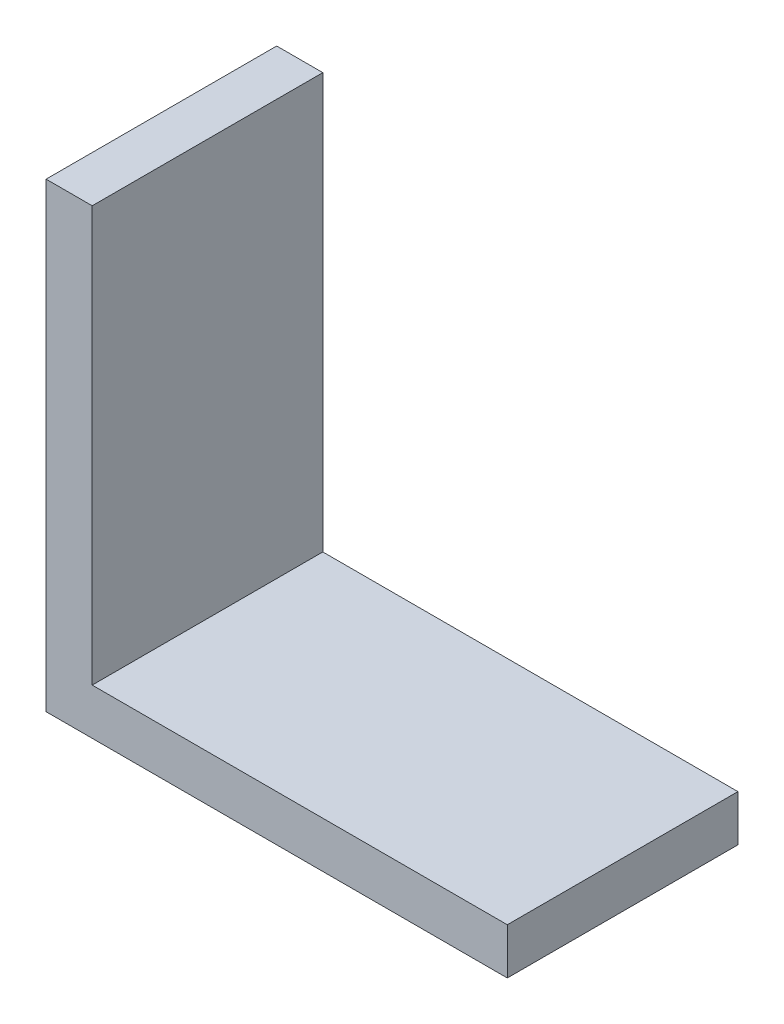
ISO-10303-21;
HEADER;
FILE_DESCRIPTION(('STEP AP214'),'2;1');
FILE_NAME('part.step','',(''),(''),'','','');
FILE_SCHEMA(('AUTOMOTIVE_DESIGN { 1 0 10303 214 1 1 1 1 }'));
ENDSEC;
DATA;
#1=APPLICATION_CONTEXT('core data for automotive mechanical design processes');
#2=APPLICATION_PROTOCOL_DEFINITION('international standard','automotive_design',2000,#1);
#3=PRODUCT_CONTEXT('',#1,'mechanical');
#4=PRODUCT('Part','Part','',(#3));
#5=PRODUCT_RELATED_PRODUCT_CATEGORY('part','',(#4));
#6=PRODUCT_DEFINITION_FORMATION('','',#4);
#7=PRODUCT_DEFINITION_CONTEXT('part definition',#1,'design');
#8=PRODUCT_DEFINITION('design','',#6,#7);
#9=PRODUCT_DEFINITION_SHAPE('','',#8);
#10=(LENGTH_UNIT() NAMED_UNIT(*) SI_UNIT(.MILLI.,.METRE.));
#11=(NAMED_UNIT(*) PLANE_ANGLE_UNIT() SI_UNIT($,.RADIAN.));
#12=(NAMED_UNIT(*) SI_UNIT($,.STERADIAN.) SOLID_ANGLE_UNIT());
#13=UNCERTAINTY_MEASURE_WITH_UNIT(LENGTH_MEASURE(1.E-05),#10,'distance_accuracy_value','');
#14=(GEOMETRIC_REPRESENTATION_CONTEXT(3) GLOBAL_UNCERTAINTY_ASSIGNED_CONTEXT((#13)) GLOBAL_UNIT_ASSIGNED_CONTEXT((#10,
#11,#12)) REPRESENTATION_CONTEXT('',''));
#15=CARTESIAN_POINT('',(0.,0.,0.));
#16=DIRECTION('',(0.,0.,1.));
#17=DIRECTION('',(1.,0.,0.));
#18=AXIS2_PLACEMENT_3D('',#15,#16,#17);
#19=CARTESIAN_POINT('',(0.,0.,10.));
#20=DIRECTION('',(0.,1.,0.));
#21=DIRECTION('',(0.,0.,1.));
#22=AXIS2_PLACEMENT_3D('',#19,#20,#21);
#23=PLANE('',#22);
#24=DIRECTION('',(1.,0.,0.));
#25=VECTOR('',#24,1.);
#26=CARTESIAN_POINT('',(0.,0.,-10.));
#27=LINE('',#26,#25);
#28=CARTESIAN_POINT('',(0.,0.,-10.));
#29=VERTEX_POINT('',#28);
#30=CARTESIAN_POINT('',(40.,0.,-10.));
#31=VERTEX_POINT('',#30);
#32=EDGE_CURVE('E115',#29,#31,#27,.T.);
#33=ORIENTED_EDGE('',*,*,#32,.T.);
#34=DIRECTION('',(0.,0.,-1.));
#35=VECTOR('',#34,1.);
#36=CARTESIAN_POINT('',(40.,0.,10.));
#37=LINE('',#36,#35);
#38=CARTESIAN_POINT('',(40.,0.,10.));
#39=VERTEX_POINT('',#38);
#40=EDGE_CURVE('E11',#39,#31,#37,.T.);
#41=ORIENTED_EDGE('',*,*,#40,.F.);
#42=DIRECTION('',(1.,0.,0.));
#43=VECTOR('',#42,1.);
#44=CARTESIAN_POINT('',(0.,0.,10.));
#45=LINE('',#44,#43);
#46=CARTESIAN_POINT('',(0.,0.,10.));
#47=VERTEX_POINT('',#46);
#48=EDGE_CURVE('E80',#47,#39,#45,.T.);
#49=ORIENTED_EDGE('',*,*,#48,.F.);
#50=DIRECTION('',(0.,0.,-1.));
#51=VECTOR('',#50,1.);
#52=CARTESIAN_POINT('',(0.,0.,10.));
#53=LINE('',#52,#51);
#54=EDGE_CURVE('E111',#47,#29,#53,.T.);
#55=ORIENTED_EDGE('',*,*,#54,.T.);
#56=EDGE_LOOP('',(#33,#41,#49,#55));
#57=FACE_BOUND('',#56,.T.);
#58=ADVANCED_FACE('F34',(#57),#23,.F.);
#59=CARTESIAN_POINT('',(40.,4.,10.));
#60=DIRECTION('',(1.,0.,0.));
#61=DIRECTION('',(0.,0.,-1.));
#62=AXIS2_PLACEMENT_3D('',#59,#60,#61);
#63=PLANE('',#62);
#64=DIRECTION('',(0.,-1.,0.));
#65=VECTOR('',#64,1.);
#66=CARTESIAN_POINT('',(40.,4.,-10.));
#67=LINE('',#66,#65);
#68=CARTESIAN_POINT('',(40.,4.,-10.));
#69=VERTEX_POINT('',#68);
#70=EDGE_CURVE('E118',#69,#31,#67,.T.);
#71=ORIENTED_EDGE('',*,*,#70,.F.);
#72=DIRECTION('',(0.,0.,-1.));
#73=VECTOR('',#72,1.);
#74=CARTESIAN_POINT('',(40.,4.,10.));
#75=LINE('',#74,#73);
#76=CARTESIAN_POINT('',(40.,4.,10.));
#77=VERTEX_POINT('',#76);
#78=EDGE_CURVE('E42',#77,#69,#75,.T.);
#79=ORIENTED_EDGE('',*,*,#78,.F.);
#80=DIRECTION('',(0.,-1.,0.));
#81=VECTOR('',#80,1.);
#82=CARTESIAN_POINT('',(40.,4.,10.));
#83=LINE('',#82,#81);
#84=EDGE_CURVE('E204',#77,#39,#83,.T.);
#85=ORIENTED_EDGE('',*,*,#84,.T.);
#86=ORIENTED_EDGE('',*,*,#40,.T.);
#87=EDGE_LOOP('',(#71,#79,#85,#86));
#88=FACE_BOUND('',#87,.T.);
#89=ADVANCED_FACE('F136',(#88),#63,.T.);
#90=CARTESIAN_POINT('',(0.,4.,10.));
#91=DIRECTION('',(0.,1.,0.));
#92=DIRECTION('',(0.,0.,1.));
#93=AXIS2_PLACEMENT_3D('',#90,#91,#92);
#94=PLANE('',#93);
#95=DIRECTION('',(1.,0.,0.));
#96=VECTOR('',#95,1.);
#97=CARTESIAN_POINT('',(0.,4.,-10.));
#98=LINE('',#97,#96);
#99=CARTESIAN_POINT('',(4.,4.,-10.));
#100=VERTEX_POINT('',#99);
#101=EDGE_CURVE('E121',#100,#69,#98,.T.);
#102=ORIENTED_EDGE('',*,*,#101,.F.);
#103=DIRECTION('',(0.,0.,-1.));
#104=VECTOR('',#103,1.);
#105=CARTESIAN_POINT('',(4.,4.,10.));
#106=LINE('',#105,#104);
#107=CARTESIAN_POINT('',(4.,4.,10.));
#108=VERTEX_POINT('',#107);
#109=EDGE_CURVE('E101',#108,#100,#106,.T.);
#110=ORIENTED_EDGE('',*,*,#109,.F.);
#111=DIRECTION('',(1.,0.,0.));
#112=VECTOR('',#111,1.);
#113=CARTESIAN_POINT('',(0.,4.,10.));
#114=LINE('',#113,#112);
#115=EDGE_CURVE('E107',#108,#77,#114,.T.);
#116=ORIENTED_EDGE('',*,*,#115,.T.);
#117=ORIENTED_EDGE('',*,*,#78,.T.);
#118=EDGE_LOOP('',(#102,#110,#116,#117));
#119=FACE_BOUND('',#118,.T.);
#120=ADVANCED_FACE('F133',(#119),#94,.T.);
#121=CARTESIAN_POINT('',(4.,40.,10.));
#122=DIRECTION('',(1.,0.,0.));
#123=DIRECTION('',(0.,1.,0.));
#124=AXIS2_PLACEMENT_3D('',#121,#122,#123);
#125=PLANE('',#124);
#126=DIRECTION('',(0.,-1.,0.));
#127=VECTOR('',#126,1.);
#128=CARTESIAN_POINT('',(4.,40.,-10.));
#129=LINE('',#128,#127);
#130=CARTESIAN_POINT('',(4.,40.,-10.));
#131=VERTEX_POINT('',#130);
#132=EDGE_CURVE('E96',#131,#100,#129,.T.);
#133=ORIENTED_EDGE('',*,*,#132,.F.);
#134=DIRECTION('',(0.,0.,-1.));
#135=VECTOR('',#134,1.);
#136=CARTESIAN_POINT('',(4.,40.,10.));
#137=LINE('',#136,#135);
#138=CARTESIAN_POINT('',(4.,40.,10.));
#139=VERTEX_POINT('',#138);
#140=EDGE_CURVE('E91',#139,#131,#137,.T.);
#141=ORIENTED_EDGE('',*,*,#140,.F.);
#142=DIRECTION('',(0.,-1.,0.));
#143=VECTOR('',#142,1.);
#144=CARTESIAN_POINT('',(4.,40.,10.));
#145=LINE('',#144,#143);
#146=EDGE_CURVE('E94',#139,#108,#145,.T.);
#147=ORIENTED_EDGE('',*,*,#146,.T.);
#148=ORIENTED_EDGE('',*,*,#109,.T.);
#149=EDGE_LOOP('',(#133,#141,#147,#148));
#150=FACE_BOUND('',#149,.T.);
#151=ADVANCED_FACE('F93',(#150),#125,.T.);
#152=CARTESIAN_POINT('',(0.,40.,10.));
#153=DIRECTION('',(0.,1.,0.));
#154=DIRECTION('',(0.,0.,1.));
#155=AXIS2_PLACEMENT_3D('',#152,#153,#154);
#156=PLANE('',#155);
#157=DIRECTION('',(1.,0.,0.));
#158=VECTOR('',#157,1.);
#159=CARTESIAN_POINT('',(0.,40.,-10.));
#160=LINE('',#159,#158);
#161=CARTESIAN_POINT('',(0.,40.,-10.));
#162=VERTEX_POINT('',#161);
#163=EDGE_CURVE('E125',#162,#131,#160,.T.);
#164=ORIENTED_EDGE('',*,*,#163,.F.);
#165=DIRECTION('',(0.,0.,-1.));
#166=VECTOR('',#165,1.);
#167=CARTESIAN_POINT('',(0.,40.,10.));
#168=LINE('',#167,#166);
#169=CARTESIAN_POINT('',(0.,40.,10.));
#170=VERTEX_POINT('',#169);
#171=EDGE_CURVE('E71',#170,#162,#168,.T.);
#172=ORIENTED_EDGE('',*,*,#171,.F.);
#173=DIRECTION('',(1.,0.,0.));
#174=VECTOR('',#173,1.);
#175=CARTESIAN_POINT('',(0.,40.,10.));
#176=LINE('',#175,#174);
#177=EDGE_CURVE('E105',#170,#139,#176,.T.);
#178=ORIENTED_EDGE('',*,*,#177,.T.);
#179=ORIENTED_EDGE('',*,*,#140,.T.);
#180=EDGE_LOOP('',(#164,#172,#178,#179));
#181=FACE_BOUND('',#180,.T.);
#182=ADVANCED_FACE('F109',(#181),#156,.T.);
#183=CARTESIAN_POINT('',(0.,40.,10.));
#184=DIRECTION('',(1.,0.,0.));
#185=DIRECTION('',(0.,1.,0.));
#186=AXIS2_PLACEMENT_3D('',#183,#184,#185);
#187=PLANE('',#186);
#188=DIRECTION('',(0.,-1.,0.));
#189=VECTOR('',#188,1.);
#190=CARTESIAN_POINT('',(0.,40.,-10.));
#191=LINE('',#190,#189);
#192=EDGE_CURVE('E74',#162,#29,#191,.T.);
#193=ORIENTED_EDGE('',*,*,#192,.T.);
#194=ORIENTED_EDGE('',*,*,#54,.F.);
#195=DIRECTION('',(0.,-1.,0.));
#196=VECTOR('',#195,1.);
#197=CARTESIAN_POINT('',(0.,40.,10.));
#198=LINE('',#197,#196);
#199=EDGE_CURVE('E50',#170,#47,#198,.T.);
#200=ORIENTED_EDGE('',*,*,#199,.F.);
#201=ORIENTED_EDGE('',*,*,#171,.T.);
#202=EDGE_LOOP('',(#193,#194,#200,#201));
#203=FACE_BOUND('',#202,.T.);
#204=ADVANCED_FACE('F141',(#203),#187,.F.);
#205=CARTESIAN_POINT('',(40.,0.,10.));
#206=DIRECTION('',(0.,0.,-1.));
#207=DIRECTION('',(-1.,0.,0.));
#208=AXIS2_PLACEMENT_3D('',#205,#206,#207);
#209=PLANE('',#208);
#210=ORIENTED_EDGE('',*,*,#48,.T.);
#211=ORIENTED_EDGE('',*,*,#84,.F.);
#212=ORIENTED_EDGE('',*,*,#115,.F.);
#213=ORIENTED_EDGE('',*,*,#146,.F.);
#214=ORIENTED_EDGE('',*,*,#177,.F.);
#215=ORIENTED_EDGE('',*,*,#199,.T.);
#216=EDGE_LOOP('',(#210,#211,#212,#213,#214,#215));
#217=FACE_BOUND('',#216,.T.);
#218=ADVANCED_FACE('F104',(#217),#209,.F.);
#219=CARTESIAN_POINT('',(40.,0.,-10.));
#220=DIRECTION('',(0.,0.,-1.));
#221=DIRECTION('',(-1.,0.,0.));
#222=AXIS2_PLACEMENT_3D('',#219,#220,#221);
#223=PLANE('',#222);
#224=ORIENTED_EDGE('',*,*,#32,.F.);
#225=ORIENTED_EDGE('',*,*,#192,.F.);
#226=ORIENTED_EDGE('',*,*,#163,.T.);
#227=ORIENTED_EDGE('',*,*,#132,.T.);
#228=ORIENTED_EDGE('',*,*,#101,.T.);
#229=ORIENTED_EDGE('',*,*,#70,.T.);
#230=EDGE_LOOP('',(#224,#225,#226,#227,#228,#229));
#231=FACE_BOUND('',#230,.T.);
#232=ADVANCED_FACE('F139',(#231),#223,.T.);
#233=CLOSED_SHELL('',(#58,#89,#120,#151,#182,#204,#218,#232));
#234=MANIFOLD_SOLID_BREP('B2',#233);
#235=ADVANCED_BREP_SHAPE_REPRESENTATION('',(#18,#234),#14);
#236=SHAPE_DEFINITION_REPRESENTATION(#9,#235);
ENDSEC;
END-ISO-10303-21;
